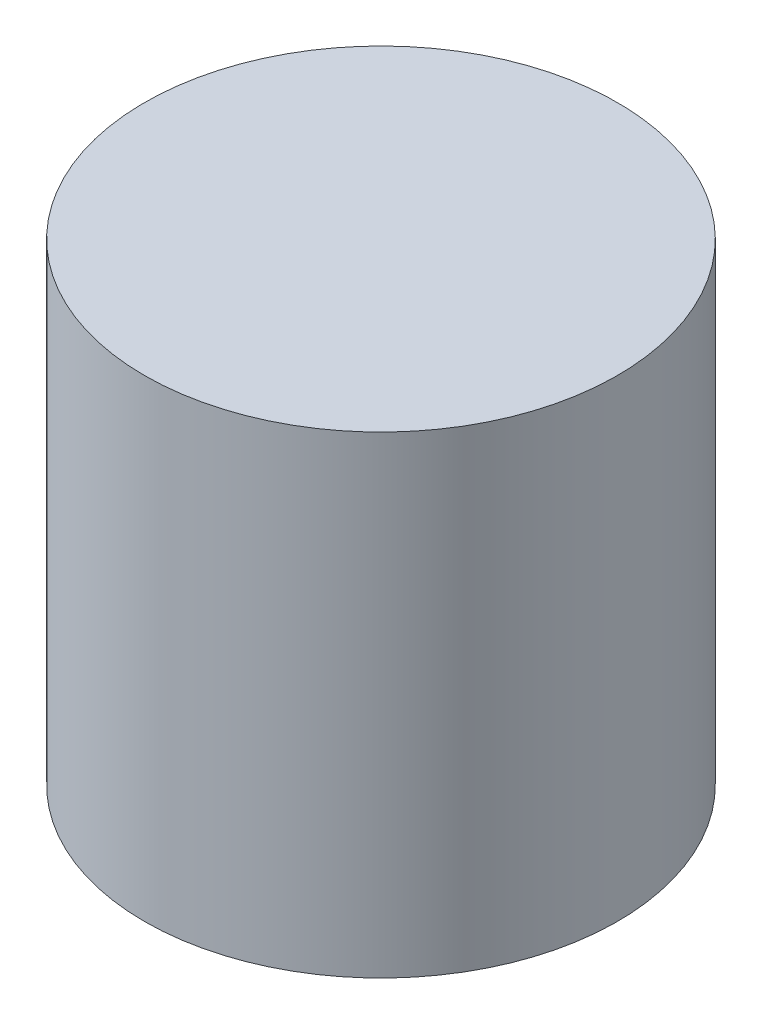
ISO-10303-21;
HEADER;
FILE_DESCRIPTION(('STEP AP214'),'2;1');
FILE_NAME('part.step','',(''),(''),'','','');
FILE_SCHEMA(('AUTOMOTIVE_DESIGN { 1 0 10303 214 1 1 1 1 }'));
ENDSEC;
DATA;
#1=APPLICATION_CONTEXT('core data for automotive mechanical design processes');
#2=APPLICATION_PROTOCOL_DEFINITION('international standard','automotive_design',2000,#1);
#3=PRODUCT_CONTEXT('',#1,'mechanical');
#4=PRODUCT('Part','Part','',(#3));
#5=PRODUCT_RELATED_PRODUCT_CATEGORY('part','',(#4));
#6=PRODUCT_DEFINITION_FORMATION('','',#4);
#7=PRODUCT_DEFINITION_CONTEXT('part definition',#1,'design');
#8=PRODUCT_DEFINITION('design','',#6,#7);
#9=PRODUCT_DEFINITION_SHAPE('','',#8);
#10=(LENGTH_UNIT() NAMED_UNIT(*) SI_UNIT(.MILLI.,.METRE.));
#11=(NAMED_UNIT(*) PLANE_ANGLE_UNIT() SI_UNIT($,.RADIAN.));
#12=(NAMED_UNIT(*) SI_UNIT($,.STERADIAN.) SOLID_ANGLE_UNIT());
#13=UNCERTAINTY_MEASURE_WITH_UNIT(LENGTH_MEASURE(1.E-05),#10,'distance_accuracy_value','');
#14=(GEOMETRIC_REPRESENTATION_CONTEXT(3) GLOBAL_UNCERTAINTY_ASSIGNED_CONTEXT((#13)) GLOBAL_UNIT_ASSIGNED_CONTEXT((#10,
#11,#12)) REPRESENTATION_CONTEXT('',''));
#15=CARTESIAN_POINT('',(0.,0.,0.));
#16=DIRECTION('',(0.,0.,1.));
#17=DIRECTION('',(1.,0.,0.));
#18=AXIS2_PLACEMENT_3D('',#15,#16,#17);
#19=CARTESIAN_POINT('',(0.,3.,0.));
#20=DIRECTION('',(0.,-1.,0.));
#21=DIRECTION('',(0.,0.,-1.));
#22=AXIS2_PLACEMENT_3D('',#19,#20,#21);
#23=CYLINDRICAL_SURFACE('',#22,1.5);
#24=CARTESIAN_POINT('',(0.,3.,0.));
#25=DIRECTION('',(0.,1.,0.));
#26=DIRECTION('',(0.,0.,1.));
#27=AXIS2_PLACEMENT_3D('',#24,#25,#26);
#28=CIRCLE('',#27,1.5);
#29=CARTESIAN_POINT('',(0.,3.,1.5));
#30=VERTEX_POINT('',#29);
#31=EDGE_CURVE('E10',#30,#30,#28,.T.);
#32=ORIENTED_EDGE('',*,*,#31,.F.);
#33=EDGE_LOOP('',(#32));
#34=FACE_BOUND('',#33,.T.);
#35=CARTESIAN_POINT('',(0.,0.,0.));
#36=DIRECTION('',(0.,1.,0.));
#37=DIRECTION('',(0.,0.,1.));
#38=AXIS2_PLACEMENT_3D('',#35,#36,#37);
#39=CIRCLE('',#38,1.5);
#40=CARTESIAN_POINT('',(0.,0.,1.5));
#41=VERTEX_POINT('',#40);
#42=EDGE_CURVE('E33',#41,#41,#39,.T.);
#43=ORIENTED_EDGE('',*,*,#42,.T.);
#44=EDGE_LOOP('',(#43));
#45=FACE_BOUND('',#44,.T.);
#46=ADVANCED_FACE('F30',(#34,#45),#23,.T.);
#47=CARTESIAN_POINT('',(0.,3.,0.));
#48=DIRECTION('',(0.,1.,0.));
#49=DIRECTION('',(0.,0.,1.));
#50=AXIS2_PLACEMENT_3D('',#47,#48,#49);
#51=PLANE('',#50);
#52=ORIENTED_EDGE('',*,*,#31,.T.);
#53=EDGE_LOOP('',(#52));
#54=FACE_BOUND('',#53,.T.);
#55=ADVANCED_FACE('F45',(#54),#51,.T.);
#56=CARTESIAN_POINT('',(0.,0.,0.));
#57=DIRECTION('',(0.,1.,0.));
#58=DIRECTION('',(0.,0.,1.));
#59=AXIS2_PLACEMENT_3D('',#56,#57,#58);
#60=PLANE('',#59);
#61=ORIENTED_EDGE('',*,*,#42,.F.);
#62=EDGE_LOOP('',(#61));
#63=FACE_BOUND('',#62,.T.);
#64=ADVANCED_FACE('F43',(#63),#60,.F.);
#65=CLOSED_SHELL('',(#46,#55,#64));
#66=MANIFOLD_SOLID_BREP('B2',#65);
#67=ADVANCED_BREP_SHAPE_REPRESENTATION('',(#18,#66),#14);
#68=SHAPE_DEFINITION_REPRESENTATION(#9,#67);
ENDSEC;
END-ISO-10303-21;
